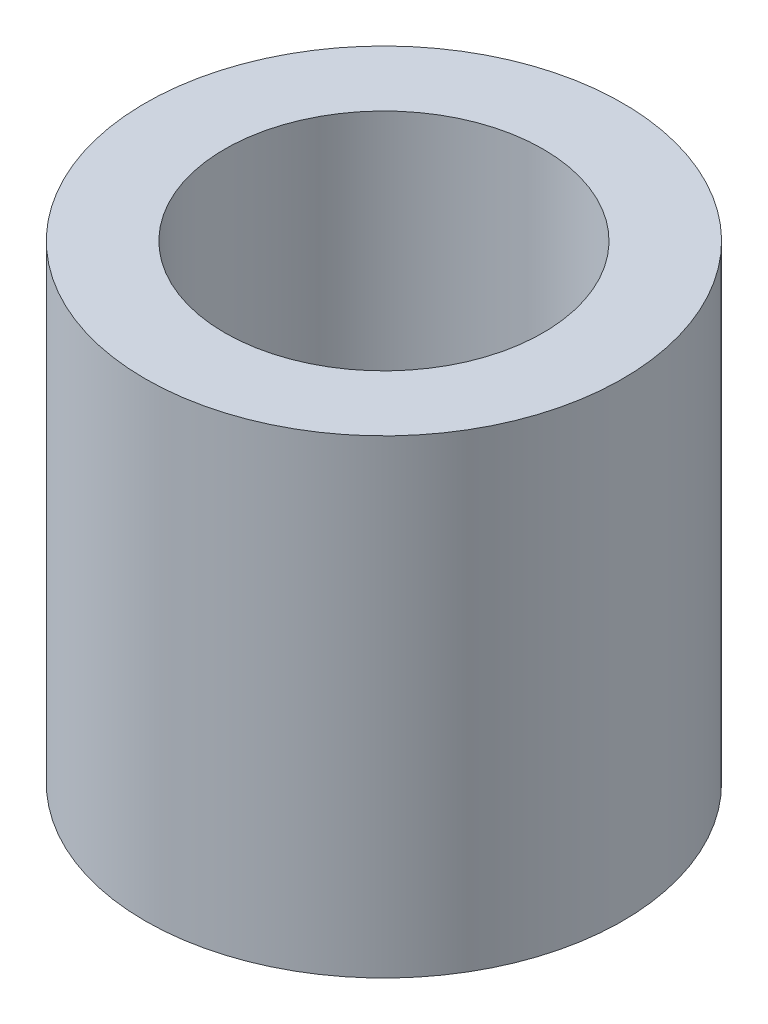
ISO-10303-21;
HEADER;
FILE_DESCRIPTION(('STEP AP214'),'2;1');
FILE_NAME('part.step','',(''),(''),'','','');
FILE_SCHEMA(('AUTOMOTIVE_DESIGN { 1 0 10303 214 1 1 1 1 }'));
ENDSEC;
DATA;
#1=APPLICATION_CONTEXT('core data for automotive mechanical design processes');
#2=APPLICATION_PROTOCOL_DEFINITION('international standard','automotive_design',2000,#1);
#3=PRODUCT_CONTEXT('',#1,'mechanical');
#4=PRODUCT('Part','Part','',(#3));
#5=PRODUCT_RELATED_PRODUCT_CATEGORY('part','',(#4));
#6=PRODUCT_DEFINITION_FORMATION('','',#4);
#7=PRODUCT_DEFINITION_CONTEXT('part definition',#1,'design');
#8=PRODUCT_DEFINITION('design','',#6,#7);
#9=PRODUCT_DEFINITION_SHAPE('','',#8);
#10=(LENGTH_UNIT() NAMED_UNIT(*) SI_UNIT(.MILLI.,.METRE.));
#11=(NAMED_UNIT(*) PLANE_ANGLE_UNIT() SI_UNIT($,.RADIAN.));
#12=(NAMED_UNIT(*) SI_UNIT($,.STERADIAN.) SOLID_ANGLE_UNIT());
#13=UNCERTAINTY_MEASURE_WITH_UNIT(LENGTH_MEASURE(1.E-05),#10,'distance_accuracy_value','');
#14=(GEOMETRIC_REPRESENTATION_CONTEXT(3) GLOBAL_UNCERTAINTY_ASSIGNED_CONTEXT((#13)) GLOBAL_UNIT_ASSIGNED_CONTEXT((#10,
#11,#12)) REPRESENTATION_CONTEXT('',''));
#15=CARTESIAN_POINT('',(0.,0.,0.));
#16=DIRECTION('',(0.,0.,1.));
#17=DIRECTION('',(1.,0.,0.));
#18=AXIS2_PLACEMENT_3D('',#15,#16,#17);
#19=CARTESIAN_POINT('',(0.,14.75,0.));
#20=DIRECTION('',(0.,-1.,0.));
#21=DIRECTION('',(0.,0.,-1.));
#22=AXIS2_PLACEMENT_3D('',#19,#20,#21);
#23=CYLINDRICAL_SURFACE('',#22,7.5);
#24=CARTESIAN_POINT('',(0.,14.75,0.));
#25=DIRECTION('',(0.,1.,0.));
#26=DIRECTION('',(0.,0.,1.));
#27=AXIS2_PLACEMENT_3D('',#24,#25,#26);
#28=CIRCLE('',#27,7.5);
#29=CARTESIAN_POINT('',(0.,14.75,7.5));
#30=VERTEX_POINT('',#29);
#31=EDGE_CURVE('E10',#30,#30,#28,.T.);
#32=ORIENTED_EDGE('',*,*,#31,.F.);
#33=EDGE_LOOP('',(#32));
#34=FACE_BOUND('',#33,.T.);
#35=CARTESIAN_POINT('',(0.,0.,0.));
#36=DIRECTION('',(0.,1.,0.));
#37=DIRECTION('',(0.,0.,1.));
#38=AXIS2_PLACEMENT_3D('',#35,#36,#37);
#39=CIRCLE('',#38,7.5);
#40=CARTESIAN_POINT('',(0.,0.,7.5));
#41=VERTEX_POINT('',#40);
#42=EDGE_CURVE('E40',#41,#41,#39,.T.);
#43=ORIENTED_EDGE('',*,*,#42,.T.);
#44=EDGE_LOOP('',(#43));
#45=FACE_BOUND('',#44,.T.);
#46=ADVANCED_FACE('F37',(#34,#45),#23,.T.);
#47=CARTESIAN_POINT('',(0.,14.75,0.));
#48=DIRECTION('',(0.,1.,0.));
#49=DIRECTION('',(0.,0.,1.));
#50=AXIS2_PLACEMENT_3D('',#47,#48,#49);
#51=PLANE('',#50);
#52=CARTESIAN_POINT('',(0.,14.75,0.));
#53=DIRECTION('',(0.,1.,0.));
#54=DIRECTION('',(0.,0.,1.));
#55=AXIS2_PLACEMENT_3D('',#52,#53,#54);
#56=CIRCLE('',#55,5.);
#57=CARTESIAN_POINT('',(0.,14.75,5.));
#58=VERTEX_POINT('',#57);
#59=EDGE_CURVE('E51',#58,#58,#56,.T.);
#60=ORIENTED_EDGE('',*,*,#59,.F.);
#61=EDGE_LOOP('',(#60));
#62=FACE_BOUND('',#61,.T.);
#63=ORIENTED_EDGE('',*,*,#31,.T.);
#64=EDGE_LOOP('',(#63));
#65=FACE_BOUND('',#64,.T.);
#66=ADVANCED_FACE('F68',(#62,#65),#51,.T.);
#67=CARTESIAN_POINT('',(0.,0.,0.));
#68=DIRECTION('',(0.,1.,0.));
#69=DIRECTION('',(0.,0.,1.));
#70=AXIS2_PLACEMENT_3D('',#67,#68,#69);
#71=PLANE('',#70);
#72=ORIENTED_EDGE('',*,*,#42,.F.);
#73=EDGE_LOOP('',(#72));
#74=FACE_BOUND('',#73,.T.);
#75=ADVANCED_FACE('F64',(#74),#71,.F.);
#76=CARTESIAN_POINT('',(0.,4.75,0.));
#77=DIRECTION('',(0.,1.,0.));
#78=DIRECTION('',(0.,0.,1.));
#79=AXIS2_PLACEMENT_3D('',#76,#77,#78);
#80=CYLINDRICAL_SURFACE('',#79,5.);
#81=CARTESIAN_POINT('',(0.,4.75,0.));
#82=DIRECTION('',(0.,1.,0.));
#83=DIRECTION('',(0.,0.,1.));
#84=AXIS2_PLACEMENT_3D('',#81,#82,#83);
#85=CIRCLE('',#84,5.);
#86=CARTESIAN_POINT('',(0.,4.75,5.));
#87=VERTEX_POINT('',#86);
#88=EDGE_CURVE('E49',#87,#87,#85,.T.);
#89=ORIENTED_EDGE('',*,*,#88,.F.);
#90=EDGE_LOOP('',(#89));
#91=FACE_BOUND('',#90,.T.);
#92=ORIENTED_EDGE('',*,*,#59,.T.);
#93=EDGE_LOOP('',(#92));
#94=FACE_BOUND('',#93,.T.);
#95=ADVANCED_FACE('F61',(#91,#94),#80,.F.);
#96=CARTESIAN_POINT('',(0.,4.75,0.));
#97=DIRECTION('',(0.,1.,0.));
#98=DIRECTION('',(0.,0.,1.));
#99=AXIS2_PLACEMENT_3D('',#96,#97,#98);
#100=PLANE('',#99);
#101=ORIENTED_EDGE('',*,*,#88,.T.);
#102=EDGE_LOOP('',(#101));
#103=FACE_BOUND('',#102,.T.);
#104=ADVANCED_FACE('F59',(#103),#100,.T.);
#105=CLOSED_SHELL('',(#46,#66,#75,#95,#104));
#106=MANIFOLD_SOLID_BREP('B2',#105);
#107=ADVANCED_BREP_SHAPE_REPRESENTATION('',(#18,#106),#14);
#108=SHAPE_DEFINITION_REPRESENTATION(#9,#107);
ENDSEC;
END-ISO-10303-21;
